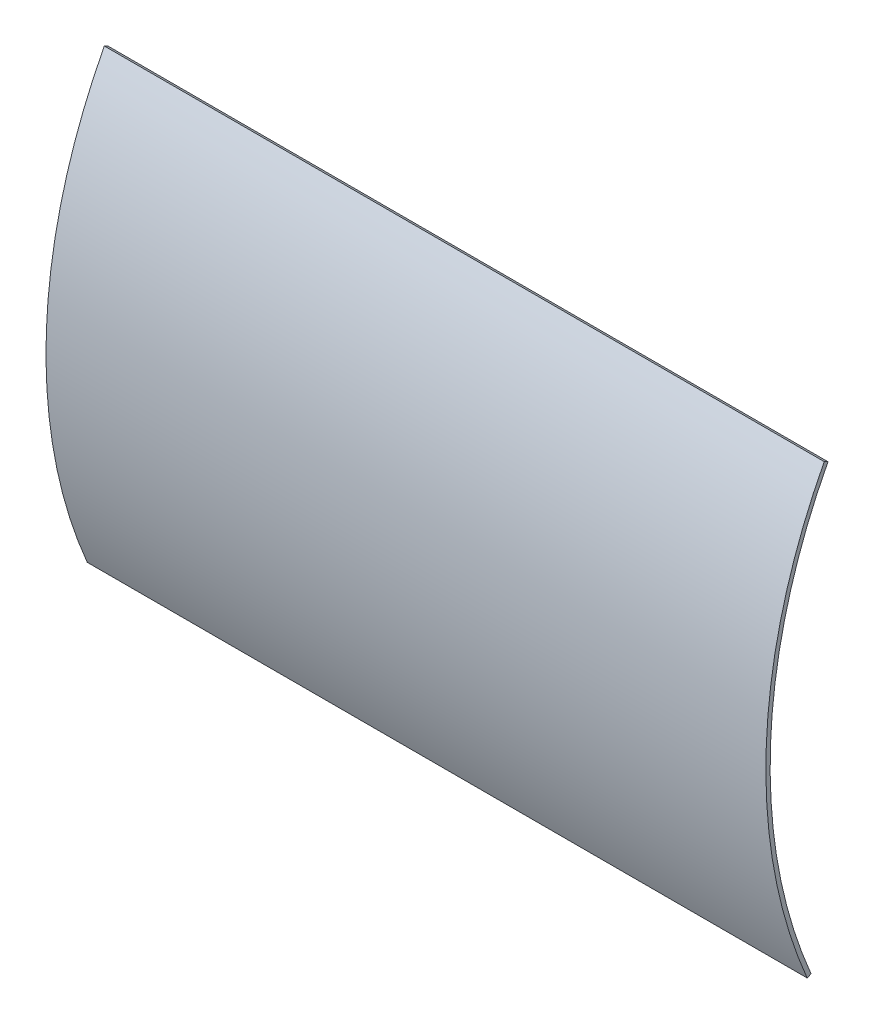
ISO-10303-21;
HEADER;
FILE_DESCRIPTION(('STEP AP214'),'2;1');
FILE_NAME('part.step','',(''),(''),'','','');
FILE_SCHEMA(('AUTOMOTIVE_DESIGN { 1 0 10303 214 1 1 1 1 }'));
ENDSEC;
DATA;
#1=APPLICATION_CONTEXT('core data for automotive mechanical design processes');
#2=APPLICATION_PROTOCOL_DEFINITION('international standard','automotive_design',2000,#1);
#3=PRODUCT_CONTEXT('',#1,'mechanical');
#4=PRODUCT('Part','Part','',(#3));
#5=PRODUCT_RELATED_PRODUCT_CATEGORY('part','',(#4));
#6=PRODUCT_DEFINITION_FORMATION('','',#4);
#7=PRODUCT_DEFINITION_CONTEXT('part definition',#1,'design');
#8=PRODUCT_DEFINITION('design','',#6,#7);
#9=PRODUCT_DEFINITION_SHAPE('','',#8);
#10=(LENGTH_UNIT() NAMED_UNIT(*) SI_UNIT(.MILLI.,.METRE.));
#11=(NAMED_UNIT(*) PLANE_ANGLE_UNIT() SI_UNIT($,.RADIAN.));
#12=(NAMED_UNIT(*) SI_UNIT($,.STERADIAN.) SOLID_ANGLE_UNIT());
#13=UNCERTAINTY_MEASURE_WITH_UNIT(LENGTH_MEASURE(1.E-05),#10,'distance_accuracy_value','');
#14=(GEOMETRIC_REPRESENTATION_CONTEXT(3) GLOBAL_UNCERTAINTY_ASSIGNED_CONTEXT((#13)) GLOBAL_UNIT_ASSIGNED_CONTEXT((#10,
#11,#12)) REPRESENTATION_CONTEXT('',''));
#15=CARTESIAN_POINT('',(0.,0.,0.));
#16=DIRECTION('',(0.,0.,1.));
#17=DIRECTION('',(1.,0.,0.));
#18=AXIS2_PLACEMENT_3D('',#15,#16,#17);
#19=CARTESIAN_POINT('',(123.698,34.9587896832126,-81.6599522618095));
#20=DIRECTION('',(-1.,0.,0.));
#21=DIRECTION('',(0.,0.,1.));
#22=AXIS2_PLACEMENT_3D('',#19,#20,#21);
#23=CYLINDRICAL_SURFACE('',#22,88.0916881717085);
#24=DIRECTION('',(-1.,0.,0.));
#25=VECTOR('',#24,1.);
#26=CARTESIAN_POINT('',(123.698,0.289892386881027,-0.677157266835718));
#27=LINE('',#26,#25);
#28=CARTESIAN_POINT('',(123.698,0.289892386881027,-0.677157266835718));
#29=VERTEX_POINT('',#28);
#30=CARTESIAN_POINT('',(-1.27,0.289892386881027,-0.677157266835718));
#31=VERTEX_POINT('',#30);
#32=EDGE_CURVE('E53',#29,#31,#27,.T.);
#33=ORIENTED_EDGE('',*,*,#32,.T.);
#34=CARTESIAN_POINT('',(-1.27,34.9587896832126,-81.6599522618095));
#35=DIRECTION('',(1.,0.,0.));
#36=DIRECTION('',(0.,0.,-1.));
#37=AXIS2_PLACEMENT_3D('',#34,#35,#36);
#38=CIRCLE('',#37,88.0916881717085);
#39=CARTESIAN_POINT('',(-1.27,75.8072846614666,-3.61159556576442));
#40=VERTEX_POINT('',#39);
#41=EDGE_CURVE('E93',#31,#40,#38,.F.);
#42=ORIENTED_EDGE('',*,*,#41,.T.);
#43=DIRECTION('',(-1.,0.,0.));
#44=VECTOR('',#43,1.);
#45=CARTESIAN_POINT('',(123.698,75.8072846614666,-3.61159556576442));
#46=LINE('',#45,#44);
#47=CARTESIAN_POINT('',(123.698,75.8072846614666,-3.61159556576442));
#48=VERTEX_POINT('',#47);
#49=EDGE_CURVE('E11',#48,#40,#46,.T.);
#50=ORIENTED_EDGE('',*,*,#49,.F.);
#51=CARTESIAN_POINT('',(123.698,34.9587896832126,-81.6599522618095));
#52=DIRECTION('',(1.,0.,0.));
#53=DIRECTION('',(0.,0.,-1.));
#54=AXIS2_PLACEMENT_3D('',#51,#52,#53);
#55=CIRCLE('',#54,88.0916881717085);
#56=EDGE_CURVE('E101',#29,#48,#55,.F.);
#57=ORIENTED_EDGE('',*,*,#56,.F.);
#58=EDGE_LOOP('',(#33,#42,#50,#57));
#59=FACE_BOUND('',#58,.T.);
#60=ADVANCED_FACE('F39',(#59),#23,.F.);
#61=CARTESIAN_POINT('',(123.698,76.1488492520138,-2.95897531593736));
#62=DIRECTION('',(0.,0.885990021486633,-0.463704304299751));
#63=DIRECTION('',(0.,0.463704304299751,0.885990021486633));
#64=AXIS2_PLACEMENT_3D('',#61,#62,#63);
#65=PLANE('',#64);
#66=ORIENTED_EDGE('',*,*,#49,.T.);
#67=DIRECTION('',(0.,-0.463704304299751,-0.885990021486633));
#68=VECTOR('',#67,1.);
#69=CARTESIAN_POINT('',(-1.27,76.1488492520138,-2.95897531593736));
#70=LINE('',#69,#68);
#71=CARTESIAN_POINT('',(-1.27,76.1488492520138,-2.95897531593736));
#72=VERTEX_POINT('',#71);
#73=EDGE_CURVE('E83',#72,#40,#70,.T.);
#74=ORIENTED_EDGE('',*,*,#73,.F.);
#75=DIRECTION('',(-1.,0.,0.));
#76=VECTOR('',#75,1.);
#77=CARTESIAN_POINT('',(123.698,76.1488492520138,-2.95897531593736));
#78=LINE('',#77,#76);
#79=CARTESIAN_POINT('',(123.698,76.1488492520138,-2.95897531593736));
#80=VERTEX_POINT('',#79);
#81=EDGE_CURVE('E46',#80,#72,#78,.T.);
#82=ORIENTED_EDGE('',*,*,#81,.F.);
#83=DIRECTION('',(0.,-0.463704304299751,-0.885990021486633));
#84=VECTOR('',#83,1.);
#85=CARTESIAN_POINT('',(123.698,76.1488492520138,-2.95897531593736));
#86=LINE('',#85,#84);
#87=EDGE_CURVE('E85',#80,#48,#86,.T.);
#88=ORIENTED_EDGE('',*,*,#87,.T.);
#89=EDGE_LOOP('',(#66,#74,#82,#88));
#90=FACE_BOUND('',#89,.T.);
#91=ADVANCED_FACE('F82',(#90),#65,.T.);
#92=CARTESIAN_POINT('',(123.698,34.9587896832126,-81.6599522618095));
#93=DIRECTION('',(-1.,0.,0.));
#94=DIRECTION('',(0.,0.,1.));
#95=AXIS2_PLACEMENT_3D('',#92,#93,#94);
#96=CYLINDRICAL_SURFACE('',#95,88.8282881717085);
#97=ORIENTED_EDGE('',*,*,#81,.T.);
#98=CARTESIAN_POINT('',(-1.27,34.9587896832126,-81.6599522618095));
#99=DIRECTION('',(-1.,0.,0.));
#100=DIRECTION('',(0.,0.,1.));
#101=AXIS2_PLACEMENT_3D('',#98,#99,#100);
#102=CIRCLE('',#101,88.8282881717085);
#103=CARTESIAN_POINT('',(-1.27,0.,0.));
#104=VERTEX_POINT('',#103);
#105=EDGE_CURVE('E94',#104,#72,#102,.T.);
#106=ORIENTED_EDGE('',*,*,#105,.F.);
#107=DIRECTION('',(-1.,0.,0.));
#108=VECTOR('',#107,1.);
#109=CARTESIAN_POINT('',(123.698,0.,0.));
#110=LINE('',#109,#108);
#111=CARTESIAN_POINT('',(123.698,0.,0.));
#112=VERTEX_POINT('',#111);
#113=EDGE_CURVE('E61',#112,#104,#110,.T.);
#114=ORIENTED_EDGE('',*,*,#113,.F.);
#115=CARTESIAN_POINT('',(123.698,34.9587896832126,-81.6599522618095));
#116=DIRECTION('',(-1.,0.,0.));
#117=DIRECTION('',(0.,0.,1.));
#118=AXIS2_PLACEMENT_3D('',#115,#116,#117);
#119=CIRCLE('',#118,88.8282881717085);
#120=EDGE_CURVE('E104',#112,#80,#119,.T.);
#121=ORIENTED_EDGE('',*,*,#120,.T.);
#122=EDGE_LOOP('',(#97,#106,#114,#121));
#123=FACE_BOUND('',#122,.T.);
#124=ADVANCED_FACE('F109',(#123),#96,.T.);
#125=CARTESIAN_POINT('',(123.698,0.289892386881027,-0.677157266835718));
#126=DIRECTION('',(0.,-0.919301203958314,-0.393554693023465));
#127=DIRECTION('',(0.,0.393554693023465,-0.919301203958314));
#128=AXIS2_PLACEMENT_3D('',#125,#126,#127);
#129=PLANE('',#128);
#130=ORIENTED_EDGE('',*,*,#113,.T.);
#131=DIRECTION('',(0.,-0.393554693023465,0.919301203958314));
#132=VECTOR('',#131,1.);
#133=CARTESIAN_POINT('',(-1.27,0.289892386881027,-0.677157266835718));
#134=LINE('',#133,#132);
#135=EDGE_CURVE('E99',#31,#104,#134,.T.);
#136=ORIENTED_EDGE('',*,*,#135,.F.);
#137=ORIENTED_EDGE('',*,*,#32,.F.);
#138=DIRECTION('',(0.,-0.393554693023465,0.919301203958314));
#139=VECTOR('',#138,1.);
#140=CARTESIAN_POINT('',(123.698,0.289892386881027,-0.677157266835718));
#141=LINE('',#140,#139);
#142=EDGE_CURVE('E106',#29,#112,#141,.T.);
#143=ORIENTED_EDGE('',*,*,#142,.T.);
#144=EDGE_LOOP('',(#130,#136,#137,#143));
#145=FACE_BOUND('',#144,.T.);
#146=ADVANCED_FACE('F113',(#145),#129,.T.);
#147=CARTESIAN_POINT('',(123.698,34.9587896832126,-81.6599522618095));
#148=DIRECTION('',(1.,0.,0.));
#149=DIRECTION('',(0.,0.,-1.));
#150=AXIS2_PLACEMENT_3D('',#147,#148,#149);
#151=PLANE('',#150);
#152=ORIENTED_EDGE('',*,*,#56,.T.);
#153=ORIENTED_EDGE('',*,*,#87,.F.);
#154=ORIENTED_EDGE('',*,*,#120,.F.);
#155=ORIENTED_EDGE('',*,*,#142,.F.);
#156=EDGE_LOOP('',(#152,#153,#154,#155));
#157=FACE_BOUND('',#156,.T.);
#158=ADVANCED_FACE('F111',(#157),#151,.T.);
#159=CARTESIAN_POINT('',(-1.27,34.9587896832126,-81.6599522618095));
#160=DIRECTION('',(1.,0.,0.));
#161=DIRECTION('',(0.,0.,-1.));
#162=AXIS2_PLACEMENT_3D('',#159,#160,#161);
#163=PLANE('',#162);
#164=ORIENTED_EDGE('',*,*,#41,.F.);
#165=ORIENTED_EDGE('',*,*,#135,.T.);
#166=ORIENTED_EDGE('',*,*,#105,.T.);
#167=ORIENTED_EDGE('',*,*,#73,.T.);
#168=EDGE_LOOP('',(#164,#165,#166,#167));
#169=FACE_BOUND('',#168,.T.);
#170=ADVANCED_FACE('F91',(#169),#163,.F.);
#171=CLOSED_SHELL('',(#60,#91,#124,#146,#158,#170));
#172=MANIFOLD_SOLID_BREP('B2',#171);
#173=ADVANCED_BREP_SHAPE_REPRESENTATION('',(#18,#172),#14);
#174=SHAPE_DEFINITION_REPRESENTATION(#9,#173);
ENDSEC;
END-ISO-10303-21;
